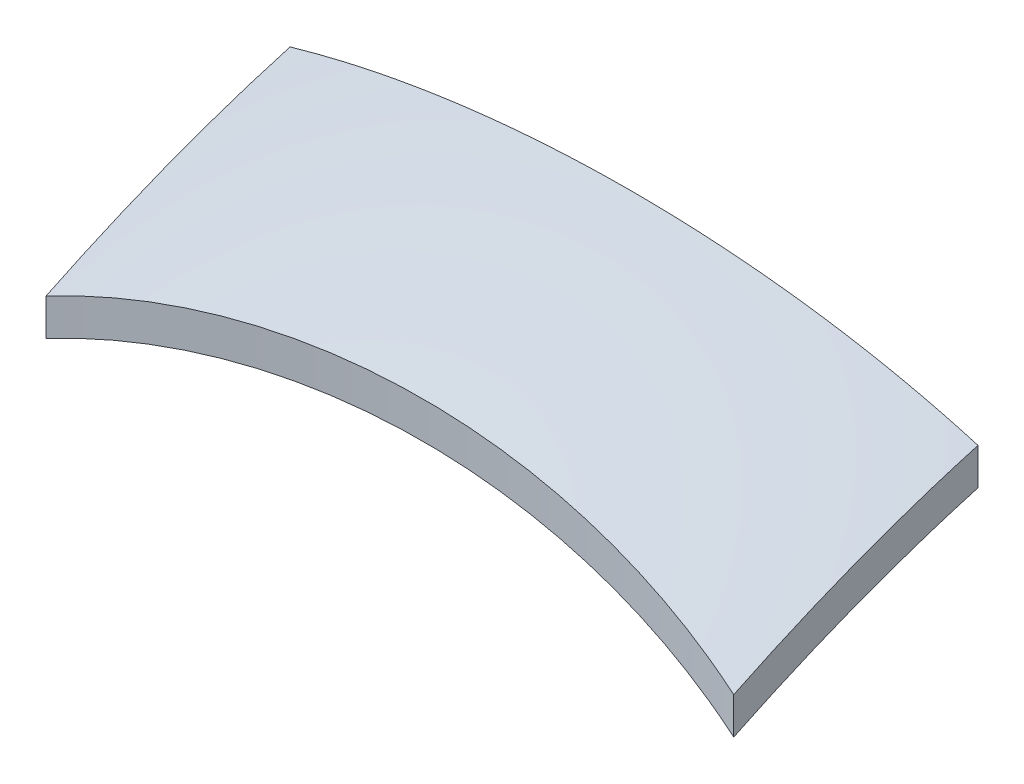
ISO-10303-21;
HEADER;
FILE_DESCRIPTION(('STEP AP214'),'2;1');
FILE_NAME('part.step','',(''),(''),'','','');
FILE_SCHEMA(('AUTOMOTIVE_DESIGN { 1 0 10303 214 1 1 1 1 }'));
ENDSEC;
DATA;
#1=APPLICATION_CONTEXT('core data for automotive mechanical design processes');
#2=APPLICATION_PROTOCOL_DEFINITION('international standard','automotive_design',2000,#1);
#3=PRODUCT_CONTEXT('',#1,'mechanical');
#4=PRODUCT('Part','Part','',(#3));
#5=PRODUCT_RELATED_PRODUCT_CATEGORY('part','',(#4));
#6=PRODUCT_DEFINITION_FORMATION('','',#4);
#7=PRODUCT_DEFINITION_CONTEXT('part definition',#1,'design');
#8=PRODUCT_DEFINITION('design','',#6,#7);
#9=PRODUCT_DEFINITION_SHAPE('','',#8);
#10=(LENGTH_UNIT() NAMED_UNIT(*) SI_UNIT(.MILLI.,.METRE.));
#11=(NAMED_UNIT(*) PLANE_ANGLE_UNIT() SI_UNIT($,.RADIAN.));
#12=(NAMED_UNIT(*) SI_UNIT($,.STERADIAN.) SOLID_ANGLE_UNIT());
#13=UNCERTAINTY_MEASURE_WITH_UNIT(LENGTH_MEASURE(1.E-05),#10,'distance_accuracy_value','');
#14=(GEOMETRIC_REPRESENTATION_CONTEXT(3) GLOBAL_UNCERTAINTY_ASSIGNED_CONTEXT((#13)) GLOBAL_UNIT_ASSIGNED_CONTEXT((#10,
#11,#12)) REPRESENTATION_CONTEXT('',''));
#15=CARTESIAN_POINT('',(0.,0.,0.));
#16=DIRECTION('',(0.,0.,1.));
#17=DIRECTION('',(1.,0.,0.));
#18=AXIS2_PLACEMENT_3D('',#15,#16,#17);
#19=CARTESIAN_POINT('',(126.173850591654,114.466203567478,6.49768900730726));
#20=DIRECTION('',(0.,0.,-1.));
#21=DIRECTION('',(0.,-1.,0.));
#22=AXIS2_PLACEMENT_3D('',#19,#20,#21);
#23=PLANE('',#22);
#24=DIRECTION('',(0.,1.,0.));
#25=VECTOR('',#24,1.);
#26=CARTESIAN_POINT('',(125.811863852919,113.198906167495,6.49768900730726));
#27=LINE('',#26,#25);
#28=CARTESIAN_POINT('',(125.811863852919,113.198906167495,6.49768900730726));
#29=VERTEX_POINT('',#28);
#30=CARTESIAN_POINT('',(125.811863852919,114.35949625455,6.49768900730726));
#31=VERTEX_POINT('',#30);
#32=EDGE_CURVE('E11',#29,#31,#27,.T.);
#33=ORIENTED_EDGE('',*,*,#32,.F.);
#34=CARTESIAN_POINT('',(104.08868330265,113.233608902771,6.49768900730732));
#35=CARTESIAN_POINT('',(104.491464831905,113.350702994404,6.49770764446056));
#36=CARTESIAN_POINT('',(104.896557955855,113.459683152823,6.49774745584348));
#37=CARTESIAN_POINT('',(105.727423012383,113.666511007373,6.49781807904073));
#38=CARTESIAN_POINT('',(106.153356595366,113.7637108144,6.4978484499051));
#39=CARTESIAN_POINT('',(107.024418051673,113.945837578094,6.49783807458635));
#40=CARTESIAN_POINT('',(107.469669247291,114.030171481494,6.4977946333217));
#41=CARTESIAN_POINT('',(108.377750123133,114.185389170672,6.4976879374449));
#42=CARTESIAN_POINT('',(108.840672003481,114.255732453803,6.49762407202172));
#43=CARTESIAN_POINT('',(109.762441485267,114.379177528341,6.49763027462186));
#44=CARTESIAN_POINT('',(110.221259794549,114.432499127557,6.49769854732288));
#45=CARTESIAN_POINT('',(111.147571647805,114.524428692073,6.49781438926014));
#46=CARTESIAN_POINT('',(111.615089119989,114.56279488435,6.49786161993366));
#47=CARTESIAN_POINT('',(112.556756904678,114.624366390424,6.49787741186209));
#48=CARTESIAN_POINT('',(113.030919443585,114.647384090776,6.49784502149786));
#49=CARTESIAN_POINT('',(113.983769532683,114.677851725014,6.497750663283));
#50=CARTESIAN_POINT('',(114.46246135058,114.685167956496,6.49768844688531));
#51=CARTESIAN_POINT('',(115.420152153381,114.683870175649,6.49768957228783));
#52=CARTESIAN_POINT('',(115.899151123477,114.675245220147,6.49775300034153));
#53=CARTESIAN_POINT('',(116.8526963491,114.642149520561,6.49784895870267));
#54=CARTESIAN_POINT('',(117.327247096835,114.617808402441,6.49788173644537));
#55=CARTESIAN_POINT('',(118.269765276739,114.553576195111,6.49786599964595));
#56=CARTESIAN_POINT('',(118.737745191914,114.513868862433,6.49781842419112));
#57=CARTESIAN_POINT('',(119.665046752496,114.419240786467,6.49770227181881));
#58=CARTESIAN_POINT('',(120.124392637525,114.36455820633,6.497634022033));
#59=CARTESIAN_POINT('',(121.047909920911,114.238244467114,6.49762951509991));
#60=CARTESIAN_POINT('',(121.512047808576,114.166367105602,6.49769529069417));
#61=CARTESIAN_POINT('',(122.422492223008,114.008051052164,6.497804120263));
#62=CARTESIAN_POINT('',(122.868892756972,113.922154045806,6.49784783602225));
#63=CARTESIAN_POINT('',(123.742169279373,113.73688668465,6.49785643543431));
#64=CARTESIAN_POINT('',(124.169170740728,113.638110936118,6.49782409362053));
#65=CARTESIAN_POINT('',(125.002074839798,113.428137585002,6.49774977828207));
#66=CARTESIAN_POINT('',(125.408141612949,113.317589592199,6.49770823858109));
#67=CARTESIAN_POINT('',(125.811863852919,113.198906167495,6.49768900730727));
#68=B_SPLINE_CURVE_WITH_KNOTS('',3,(#34,#35,#36,#37,#38,#39,#40,#41,#42,#43,#44,#45,#46,#47,#48,
#49,#50,#51,#52,#53,#54,#55,#56,#57,#58,#59,#60,#61,#62,#63,#64,#65,#66,#67),.UNSPECIFIED.,.F.,
.F.,(4,2,2,2,2,2,2,2,2,2,2,2,2,2,2,2,4),(0.,1.25822010311703,2.56854409701408,3.92774605031545,
5.33214502271117,6.71759671596168,8.1245991829964,9.5484995179903,10.9844774306185,
12.421441467489,13.8467023465268,15.2554212198993,16.6429210593176,18.0516214737741,
19.4150876405558,20.7295909237464,21.9918576644484),.UNSPECIFIED.);
#69=CARTESIAN_POINT('',(104.08868330265,113.233608902771,6.49768900730726));
#70=VERTEX_POINT('',#69);
#71=EDGE_CURVE('E86',#29,#70,#68,.F.);
#72=ORIENTED_EDGE('',*,*,#71,.T.);
#73=DIRECTION('',(0.,-1.,0.));
#74=VECTOR('',#73,1.);
#75=CARTESIAN_POINT('',(104.08868330265,114.394198989609,6.49768900730727));
#76=LINE('',#75,#74);
#77=CARTESIAN_POINT('',(104.08868330265,114.394198989609,6.49768900730727));
#78=VERTEX_POINT('',#77);
#79=EDGE_CURVE('E52',#78,#70,#76,.T.);
#80=ORIENTED_EDGE('',*,*,#79,.F.);
#81=CARTESIAN_POINT('',(125.811863852919,114.359496254549,6.49768900730715));
#82=CARTESIAN_POINT('',(125.408146769977,114.478178177028,6.497708193028));
#83=CARTESIAN_POINT('',(125.002085225358,114.588724930594,6.49774947300777));
#84=CARTESIAN_POINT('',(124.169188361884,114.798697065287,6.4978231343991));
#85=CARTESIAN_POINT('',(123.742188876506,114.897472715418,6.49785507675889));
#86=CARTESIAN_POINT('',(122.868912712375,115.082740725298,6.49784588040595));
#87=CARTESIAN_POINT('',(122.422510531312,115.168638342435,6.49780197459163));
#88=CARTESIAN_POINT('',(121.512058937909,115.32695588795,6.49769376416394));
#89=CARTESIAN_POINT('',(121.047915491743,115.398833978227,6.49762883097954));
#90=CARTESIAN_POINT('',(120.124404871071,115.525146433011,6.49763469574762));
#91=CARTESIAN_POINT('',(119.665071291822,115.579827622979,6.49770346059326));
#92=CARTESIAN_POINT('',(118.737786362137,115.674454854453,6.49781957479528));
#93=CARTESIAN_POINT('',(118.269810744857,115.714162468008,6.49786658013969));
#94=CARTESIAN_POINT('',(117.327292819608,115.778396085889,6.49788117182426));
#95=CARTESIAN_POINT('',(116.852738009388,115.802738055305,6.49784781765763));
#96=CARTESIAN_POINT('',(115.899176192653,115.835835168219,6.49775184823251));
#97=CARTESIAN_POINT('',(115.420164683916,115.844460400628,6.49768899444536));
#98=CARTESIAN_POINT('',(114.462473867601,115.845757866662,6.49768902433036));
#99=CARTESIAN_POINT('',(113.983794575948,115.838441877356,6.49775181517585));
#100=CARTESIAN_POINT('',(113.030961063358,115.807975609039,6.49784616302265));
#101=CARTESIAN_POINT('',(112.556802583944,115.78495874758,6.49787797775593));
#102=CARTESIAN_POINT('',(111.615134547292,115.723388650622,6.49786104164898));
#103=CARTESIAN_POINT('',(111.147612782104,115.685022750642,6.4978132410304));
#104=CARTESIAN_POINT('',(110.221284314268,115.593092388527,6.49769736030365));
#105=CARTESIAN_POINT('',(109.762453709833,115.539769435212,6.4976296016477));
#106=CARTESIAN_POINT('',(108.840677562386,115.416323096102,6.49762475429624));
#107=CARTESIAN_POINT('',(108.377761228887,115.345980524229,6.49768946010413));
#108=CARTESIAN_POINT('',(107.469687518712,115.19076430274,6.49779677362317));
#109=CARTESIAN_POINT('',(107.024437967994,115.106431003777,6.49784002534803));
#110=CARTESIAN_POINT('',(106.153376156516,114.924304888171,6.49784980521963));
#111=CARTESIAN_POINT('',(105.727440602338,114.827104988896,6.49781903588828));
#112=CARTESIAN_POINT('',(104.896568324446,114.62027594271,6.49774776036991));
#113=CARTESIAN_POINT('',(104.491469980956,114.511294563983,6.49770768991513));
#114=CARTESIAN_POINT('',(104.08868330265,114.394198989609,6.49768900730727));
#115=B_SPLINE_CURVE_WITH_KNOTS('',3,(#81,#82,#83,#84,#85,#86,#87,#88,#89,#90,#91,#92,#93,#94,
#95,#96,#97,#98,#99,#100,#101,#102,#103,#104,#105,#106,#107,#108,#109,#110,#111,#112,#113,#114),
.UNSPECIFIED.,.F.,.F.,(4,2,2,2,2,2,2,2,2,2,2,2,2,2,2,2,4),(0.,1.26225063860314,2.57674808492243,
3.94021943864022,5.34893664692693,6.73639936872177,8.145105478225,9.57037864620559,
11.0073802752623,12.4433206349667,13.8672086971088,15.2742239159121,16.6597126831799,
18.0640949030334,19.4232916819116,20.7336214976931,21.991857663682),.UNSPECIFIED.);
#116=EDGE_CURVE('E90',#31,#78,#115,.T.);
#117=ORIENTED_EDGE('',*,*,#116,.F.);
#118=EDGE_LOOP('',(#33,#72,#80,#117));
#119=FACE_BOUND('',#118,.T.);
#120=ADVANCED_FACE('F40',(#119),#23,.T.);
#121=CARTESIAN_POINT('',(125.811863852919,114.406481652306,6.32970912589321));
#122=DIRECTION('',(1.,0.,0.));
#123=DIRECTION('',(0.,1.,0.));
#124=AXIS2_PLACEMENT_3D('',#121,#122,#123);
#125=PLANE('',#124);
#126=ORIENTED_EDGE('',*,*,#32,.T.);
#127=CARTESIAN_POINT('',(125.811863852919,26.3415673635827,17.3261879791778));
#128=DIRECTION('',(-1.,0.,0.));
#129=DIRECTION('',(0.,0.945791064224368,-0.324775711581605));
#130=AXIS2_PLACEMENT_3D('',#127,#128,#129);
#131=ELLIPSE('',#130,92.8974816010199,51.3346379604493);
#132=CARTESIAN_POINT('',(125.811863852919,111.399518708287,14.2106202891591));
#133=VERTEX_POINT('',#132);
#134=EDGE_CURVE('E106',#133,#31,#131,.T.);
#135=ORIENTED_EDGE('',*,*,#134,.F.);
#136=DIRECTION('',(0.,-0.999999999999974,-2.27318123069327E-07));
#137=VECTOR('',#136,1.);
#138=CARTESIAN_POINT('',(125.811863852919,111.399518708287,14.2106202891591));
#139=LINE('',#138,#137);
#140=CARTESIAN_POINT('',(125.811863852919,110.238928695624,14.210620025336));
#141=VERTEX_POINT('',#140);
#142=EDGE_CURVE('E73',#133,#141,#139,.T.);
#143=ORIENTED_EDGE('',*,*,#142,.T.);
#144=CARTESIAN_POINT('',(125.811863852915,25.1809781244162,17.3261876576107));
#145=DIRECTION('',(-1.,0.,0.));
#146=DIRECTION('',(0.,0.94579106332946,-0.324775714187697));
#147=AXIS2_PLACEMENT_3D('',#144,#145,#146);
#148=ELLIPSE('',#147,92.8974808469116,51.3346376890763);
#149=EDGE_CURVE('E100',#141,#29,#148,.T.);
#150=ORIENTED_EDGE('',*,*,#149,.T.);
#151=EDGE_LOOP('',(#126,#135,#143,#150));
#152=FACE_BOUND('',#151,.T.);
#153=ADVANCED_FACE('F104',(#152),#125,.T.);
#154=CARTESIAN_POINT('',(104.08868330265,111.434735452922,14.2041485930718));
#155=DIRECTION('',(-1.,0.,0.));
#156=DIRECTION('',(0.,0.,1.));
#157=AXIS2_PLACEMENT_3D('',#154,#155,#156);
#158=PLANE('',#157);
#159=ORIENTED_EDGE('',*,*,#79,.T.);
#160=CARTESIAN_POINT('',(104.08868330265,-61.4688349220867,33.9668370734426));
#161=DIRECTION('',(1.,0.,0.));
#162=DIRECTION('',(0.,0.969730905133944,-0.244176107815857));
#163=AXIS2_PLACEMENT_3D('',#160,#161,#162);
#164=ELLIPSE('',#163,180.65753933113,71.9451527625774);
#165=CARTESIAN_POINT('',(104.08868330265,110.274145440259,14.2041483292486));
#166=VERTEX_POINT('',#165);
#167=EDGE_CURVE('E101',#70,#166,#164,.T.);
#168=ORIENTED_EDGE('',*,*,#167,.T.);
#169=DIRECTION('',(0.,0.999999999999974,2.27318121156123E-07));
#170=VECTOR('',#169,1.);
#171=CARTESIAN_POINT('',(104.08868330265,110.274145440259,14.2041483292486));
#172=LINE('',#171,#170);
#173=CARTESIAN_POINT('',(104.08868330265,111.434735452922,14.2041485930718));
#174=VERTEX_POINT('',#173);
#175=EDGE_CURVE('E78',#166,#174,#172,.T.);
#176=ORIENTED_EDGE('',*,*,#175,.T.);
#177=CARTESIAN_POINT('',(104.08868330265,-60.3082463828499,33.9668375342636));
#178=DIRECTION('',(1.,0.,0.));
#179=DIRECTION('',(0.,0.96973090539462,-0.244176106780599));
#180=AXIS2_PLACEMENT_3D('',#177,#178,#179);
#181=ELLIPSE('',#180,180.657540809186,71.9451530916547);
#182=EDGE_CURVE('E164',#78,#174,#181,.T.);
#183=ORIENTED_EDGE('',*,*,#182,.F.);
#184=EDGE_LOOP('',(#159,#168,#176,#183));
#185=FACE_BOUND('',#184,.T.);
#186=ADVANCED_FACE('F179',(#185),#158,.T.);
#187=CARTESIAN_POINT('',(125.811863852919,111.399518708287,14.2106202891591));
#188=CARTESIAN_POINT('',(125.811863852919,111.012655370733,14.210620201218));
#189=CARTESIAN_POINT('',(125.811863852919,110.625792033178,14.210620113277));
#190=CARTESIAN_POINT('',(125.811863852919,110.238928695624,14.210620025336));
#191=CARTESIAN_POINT('',(119.309703686816,114.16322839261,12.7487298494873));
#192=CARTESIAN_POINT('',(119.309703686816,113.776365055055,12.7487297615462));
#193=CARTESIAN_POINT('',(119.309703686816,113.389501717501,12.7487296736052));
#194=CARTESIAN_POINT('',(119.309703686816,113.002638379947,12.7487295856641));
#195=CARTESIAN_POINT('',(110.598961810784,114.178028128067,12.7443105757957));
#196=CARTESIAN_POINT('',(110.598961810784,113.791164790513,12.7443104878547));
#197=CARTESIAN_POINT('',(110.598961810784,113.404301452958,12.7443103999136));
#198=CARTESIAN_POINT('',(110.598961810784,113.017438115404,12.7443103119726));
#199=CARTESIAN_POINT('',(104.08868330265,111.434735452922,14.2041485930718));
#200=CARTESIAN_POINT('',(104.08868330265,111.047872115367,14.2041485051307));
#201=CARTESIAN_POINT('',(104.08868330265,110.661008777813,14.2041484171897));
#202=CARTESIAN_POINT('',(104.08868330265,110.274145440259,14.2041483292486));
#203=(BOUNDED_SURFACE() B_SPLINE_SURFACE(3,3,((#187,#188,#189,#190),(#191,#192,#193,#194),(#195,
#196,#197,#198),(#199,#200,#201,#202)),.UNSPECIFIED.,.F.,.F.,
.F.) B_SPLINE_SURFACE_WITH_KNOTS((4,4),(4,4),(0.,23.1394637100243),(0.,1.16059001266326),
.UNSPECIFIED.) GEOMETRIC_REPRESENTATION_ITEM() RATIONAL_B_SPLINE_SURFACE(((1.,1.,1.,1.),(1.,1.,
1.,1.),(1.,1.,1.,1.),(1.,1.,1.,1.))) REPRESENTATION_ITEM('') SURFACE());
#204=CARTESIAN_POINT('',(104.08868330265,111.434735452922,14.2041485930718));
#205=CARTESIAN_POINT('',(110.598961810784,114.178028128067,12.7443105757957));
#206=CARTESIAN_POINT('',(119.309703686816,114.16322839261,12.7487298494873));
#207=CARTESIAN_POINT('',(125.811863852919,111.399518708287,14.2106202891591));
#208=(BOUNDED_CURVE() B_SPLINE_CURVE(3,(#204,#205,#206,#207),.UNSPECIFIED.,.F.,
.F.) B_SPLINE_CURVE_WITH_KNOTS((4,4),(-1.,0.),
.UNSPECIFIED.) CURVE() GEOMETRIC_REPRESENTATION_ITEM() RATIONAL_B_SPLINE_CURVE((1.,1.,1.,1.)) REPRESENTATION_ITEM(''));
#209=EDGE_CURVE('E109',#174,#133,#208,.T.);
#210=CARTESIAN_POINT('',(104.08868330265,110.274145440259,14.2041483292486));
#211=CARTESIAN_POINT('',(110.598961810784,113.017438115404,12.7443103119726));
#212=CARTESIAN_POINT('',(119.309703686816,113.002638379947,12.7487295856641));
#213=CARTESIAN_POINT('',(125.811863852919,110.238928695624,14.210620025336));
#214=(BOUNDED_CURVE() B_SPLINE_CURVE(3,(#210,#211,#212,#213),.UNSPECIFIED.,.F.,
.F.) B_SPLINE_CURVE_WITH_KNOTS((4,4),(-1.,0.),
.UNSPECIFIED.) CURVE() GEOMETRIC_REPRESENTATION_ITEM() RATIONAL_B_SPLINE_CURVE((1.,1.,1.,1.)) REPRESENTATION_ITEM(''));
#215=EDGE_CURVE('E105',#166,#141,#214,.T.);
#216=ORIENTED_EDGE('',*,*,#209,.F.);
#217=ORIENTED_EDGE('',*,*,#175,.F.);
#218=ORIENTED_EDGE('',*,*,#215,.T.);
#219=ORIENTED_EDGE('',*,*,#142,.F.);
#220=EDGE_LOOP('',(#216,#217,#218,#219));
#221=FACE_BOUND('',#220,.T.);
#222=ADVANCED_FACE('F42',(#221),#203,.T.);
#223=CARTESIAN_POINT('',(125.811863852919,110.238928695624,14.210620025336));
#224=CARTESIAN_POINT('',(125.811863852919,112.334999536735,9.87879912732163));
#225=CARTESIAN_POINT('',(125.811863852919,113.860048406594,5.23464536062803));
#226=CARTESIAN_POINT('',(125.811863852919,114.4012174669,0.439220815134968));
#227=CARTESIAN_POINT('',(119.309703686816,113.002638379947,12.7487295856641));
#228=CARTESIAN_POINT('',(119.309259576354,114.963860730647,8.16424815227329));
#229=CARTESIAN_POINT('',(119.309430137646,116.28601785196,3.21888953130707));
#230=CARTESIAN_POINT('',(119.306315603899,116.51133872571,-1.85825960446365));
#231=CARTESIAN_POINT('',(110.598961810784,113.017438115404,12.7443103119726));
#232=CARTESIAN_POINT('',(110.598517207402,114.977871679927,8.16128188372977));
#233=CARTESIAN_POINT('',(110.598686908358,116.304220162312,3.21738647695989));
#234=CARTESIAN_POINT('',(110.595572129929,116.517492361142,-1.86031780090848));
#235=CARTESIAN_POINT('',(104.08868330265,110.274145440259,14.2041483292486));
#236=CARTESIAN_POINT('',(104.08868330265,112.368668306833,9.87610711058688));
#237=CARTESIAN_POINT('',(104.08868330265,113.904722684374,5.23574061462617));
#238=CARTESIAN_POINT('',(104.08868330265,114.416492807267,0.438940994291558));
#239=(BOUNDED_SURFACE() B_SPLINE_SURFACE(3,3,((#223,#224,#225,#226),(#227,#228,#229,#230),(#231,
#232,#233,#234),(#235,#236,#237,#238)),.UNSPECIFIED.,.F.,.F.,
.F.) B_SPLINE_SURFACE_WITH_KNOTS((4,4),(4,4),(0.,1.),(0.,14.4507955281138),
.UNSPECIFIED.) GEOMETRIC_REPRESENTATION_ITEM() RATIONAL_B_SPLINE_SURFACE(((1.,1.,1.,1.),(1.,1.,
1.,1.),(1.,1.,1.,1.),(1.,1.,1.,1.))) REPRESENTATION_ITEM('') SURFACE());
#240=ORIENTED_EDGE('',*,*,#149,.F.);
#241=ORIENTED_EDGE('',*,*,#215,.F.);
#242=ORIENTED_EDGE('',*,*,#167,.F.);
#243=ORIENTED_EDGE('',*,*,#71,.F.);
#244=EDGE_LOOP('',(#240,#241,#242,#243));
#245=FACE_BOUND('',#244,.T.);
#246=ADVANCED_FACE('F98',(#245),#239,.T.);
#247=CARTESIAN_POINT('',(125.811863852919,111.399518708287,14.2106202891591));
#248=CARTESIAN_POINT('',(119.309703686816,114.16322839261,12.7487298494873));
#249=CARTESIAN_POINT('',(110.598961810784,114.178028128067,12.7443105757957));
#250=CARTESIAN_POINT('',(104.08868330265,111.434735452922,14.2041485930718));
#251=CARTESIAN_POINT('',(125.811863852919,113.495589549398,9.87879939114477));
#252=CARTESIAN_POINT('',(119.309259576354,116.12445074331,8.16424841609644));
#253=CARTESIAN_POINT('',(110.598517207402,116.13846169259,8.16128214755291));
#254=CARTESIAN_POINT('',(104.08868330265,113.529258319496,9.87610737441003));
#255=CARTESIAN_POINT('',(125.811863852919,115.020638419257,5.23464562445118));
#256=CARTESIAN_POINT('',(119.309430137646,117.446607864623,3.21888979513021));
#257=CARTESIAN_POINT('',(110.598686908358,117.464810174976,3.21738674078303));
#258=CARTESIAN_POINT('',(104.08868330265,115.065312697037,5.23574087844931));
#259=CARTESIAN_POINT('',(125.811863852919,115.561807479563,0.439221078958113));
#260=CARTESIAN_POINT('',(119.306315603899,117.671928738373,-1.85825934064051));
#261=CARTESIAN_POINT('',(110.595572129929,117.678082373805,-1.86031753708534));
#262=CARTESIAN_POINT('',(104.08868330265,115.57708281993,0.438941258114703));
#263=(BOUNDED_SURFACE() B_SPLINE_SURFACE(3,3,((#247,#248,#249,#250),(#251,#252,#253,#254),(#255,
#256,#257,#258),(#259,#260,#261,#262)),.UNSPECIFIED.,.F.,.F.,
.F.) B_SPLINE_SURFACE_WITH_KNOTS((4,4),(4,4),(0.,14.4507955281138),(0.,1.),
.UNSPECIFIED.) GEOMETRIC_REPRESENTATION_ITEM() RATIONAL_B_SPLINE_SURFACE(((1.,1.,1.,1.),(1.,1.,
1.,1.),(1.,1.,1.,1.),(1.,1.,1.,1.))) REPRESENTATION_ITEM('') SURFACE());
#264=ORIENTED_EDGE('',*,*,#116,.T.);
#265=ORIENTED_EDGE('',*,*,#182,.T.);
#266=ORIENTED_EDGE('',*,*,#209,.T.);
#267=ORIENTED_EDGE('',*,*,#134,.T.);
#268=EDGE_LOOP('',(#264,#265,#266,#267));
#269=FACE_BOUND('',#268,.T.);
#270=ADVANCED_FACE('F129',(#269),#263,.T.);
#271=CLOSED_SHELL('',(#120,#153,#186,#222,#246,#270));
#272=MANIFOLD_SOLID_BREP('B2',#271);
#273=ADVANCED_BREP_SHAPE_REPRESENTATION('',(#18,#272),#14);
#274=SHAPE_DEFINITION_REPRESENTATION(#9,#273);
ENDSEC;
END-ISO-10303-21;
